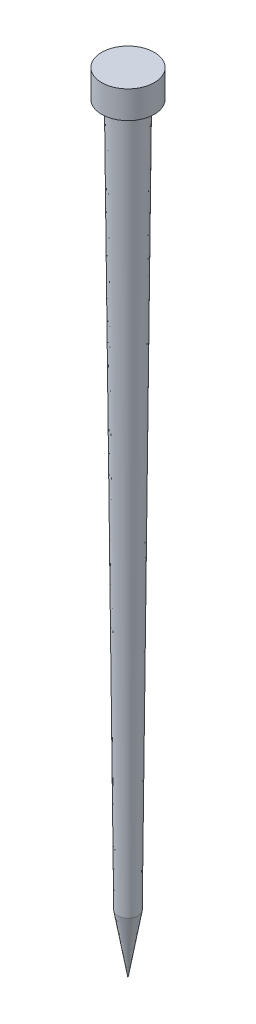
ISO-10303-21;
HEADER;
FILE_DESCRIPTION(('STEP AP214'),'2;1');
FILE_NAME('part.step','',(''),(''),'','','');
FILE_SCHEMA(('AUTOMOTIVE_DESIGN { 1 0 10303 214 1 1 1 1 }'));
ENDSEC;
DATA;
#1=APPLICATION_CONTEXT('core data for automotive mechanical design processes');
#2=APPLICATION_PROTOCOL_DEFINITION('international standard','automotive_design',2000,#1);
#3=PRODUCT_CONTEXT('',#1,'mechanical');
#4=PRODUCT('Part','Part','',(#3));
#5=PRODUCT_RELATED_PRODUCT_CATEGORY('part','',(#4));
#6=PRODUCT_DEFINITION_FORMATION('','',#4);
#7=PRODUCT_DEFINITION_CONTEXT('part definition',#1,'design');
#8=PRODUCT_DEFINITION('design','',#6,#7);
#9=PRODUCT_DEFINITION_SHAPE('','',#8);
#10=(LENGTH_UNIT() NAMED_UNIT(*) SI_UNIT(.MILLI.,.METRE.));
#11=(NAMED_UNIT(*) PLANE_ANGLE_UNIT() SI_UNIT($,.RADIAN.));
#12=(NAMED_UNIT(*) SI_UNIT($,.STERADIAN.) SOLID_ANGLE_UNIT());
#13=UNCERTAINTY_MEASURE_WITH_UNIT(LENGTH_MEASURE(1.E-05),#10,'distance_accuracy_value','');
#14=(GEOMETRIC_REPRESENTATION_CONTEXT(3) GLOBAL_UNCERTAINTY_ASSIGNED_CONTEXT((#13)) GLOBAL_UNIT_ASSIGNED_CONTEXT((#10,
#11,#12)) REPRESENTATION_CONTEXT('',''));
#15=CARTESIAN_POINT('',(0.,0.,0.));
#16=DIRECTION('',(0.,0.,1.));
#17=DIRECTION('',(1.,0.,0.));
#18=AXIS2_PLACEMENT_3D('',#15,#16,#17);
#19=CARTESIAN_POINT('',(0.,-21.4012791237792,0.));
#20=DIRECTION('',(0.,1.,0.));
#21=DIRECTION('',(0.,0.,1.));
#22=AXIS2_PLACEMENT_3D('',#19,#20,#21);
#23=CONICAL_SURFACE('',#22,0.328639164855815,0.1701475759757);
#24=CARTESIAN_POINT('',(0.,-20.4717320396996,0.));
#25=DIRECTION('',(0.,1.,0.));
#26=DIRECTION('',(0.,0.,1.));
#27=AXIS2_PLACEMENT_3D('',#24,#25,#26);
#28=CIRCLE('',#27,0.488343487882824);
#29=CARTESIAN_POINT('',(0.,-20.4717320396996,0.488343487882824));
#30=VERTEX_POINT('',#29);
#31=EDGE_CURVE('E11',#30,#30,#28,.T.);
#32=ORIENTED_EDGE('',*,*,#31,.F.);
#33=EDGE_LOOP('',(#32));
#34=FACE_BOUND('',#33,.T.);
#35=CARTESIAN_POINT('',(0.,-23.3140988372093,0.));
#36=VERTEX_POINT('',#35);
#37=VERTEX_LOOP('',#36);
#38=FACE_BOUND('',#37,.T.);
#39=ADVANCED_FACE('F41',(#34,#38),#23,.T.);
#40=CARTESIAN_POINT('',(0.,-20.4717320396996,0.));
#41=DIRECTION('',(0.,1.,0.));
#42=DIRECTION('',(0.,0.,1.));
#43=AXIS2_PLACEMENT_3D('',#40,#41,#42);
#44=CONICAL_SURFACE('',#43,0.488343487882824,0.00940924787477671);
#45=CARTESIAN_POINT('',(0.,13.4568313953488,0.));
#46=DIRECTION('',(0.,1.,0.));
#47=DIRECTION('',(0.,0.,1.));
#48=AXIS2_PLACEMENT_3D('',#45,#46,#47);
#49=CIRCLE('',#48,0.80759517287099);
#50=CARTESIAN_POINT('',(0.,13.4568313953488,0.80759517287099));
#51=VERTEX_POINT('',#50);
#52=EDGE_CURVE('E48',#51,#51,#49,.T.);
#53=ORIENTED_EDGE('',*,*,#52,.F.);
#54=EDGE_LOOP('',(#53));
#55=FACE_BOUND('',#54,.T.);
#56=ORIENTED_EDGE('',*,*,#31,.T.);
#57=EDGE_LOOP('',(#56));
#58=FACE_BOUND('',#57,.T.);
#59=ADVANCED_FACE('F52',(#55,#58),#44,.T.);
#60=CARTESIAN_POINT('',(0.80759517287099,13.4568313953488,0.));
#61=DIRECTION('',(0.,1.,0.));
#62=DIRECTION('',(0.,0.,1.));
#63=AXIS2_PLACEMENT_3D('',#60,#61,#62);
#64=PLANE('',#63);
#65=CARTESIAN_POINT('',(0.,13.4568313953488,0.));
#66=DIRECTION('',(0.,1.,0.));
#67=DIRECTION('',(0.,0.,1.));
#68=AXIS2_PLACEMENT_3D('',#65,#66,#67);
#69=CIRCLE('',#68,1.27);
#70=CARTESIAN_POINT('',(0.,13.4568313953488,1.27));
#71=VERTEX_POINT('',#70);
#72=EDGE_CURVE('E81',#71,#71,#69,.T.);
#73=ORIENTED_EDGE('',*,*,#72,.F.);
#74=EDGE_LOOP('',(#73));
#75=FACE_BOUND('',#74,.T.);
#76=ORIENTED_EDGE('',*,*,#52,.T.);
#77=EDGE_LOOP('',(#76));
#78=FACE_BOUND('',#77,.T.);
#79=ADVANCED_FACE('F57',(#75,#78),#64,.F.);
#80=CARTESIAN_POINT('',(0.,14.7859011627907,0.));
#81=DIRECTION('',(0.,1.,0.));
#82=DIRECTION('',(0.,0.,1.));
#83=AXIS2_PLACEMENT_3D('',#80,#81,#82);
#84=CYLINDRICAL_SURFACE('',#83,1.27);
#85=CARTESIAN_POINT('',(0.,14.7859011627907,0.));
#86=DIRECTION('',(0.,1.,0.));
#87=DIRECTION('',(0.,0.,1.));
#88=AXIS2_PLACEMENT_3D('',#85,#86,#87);
#89=CIRCLE('',#88,1.27);
#90=CARTESIAN_POINT('',(0.,14.7859011627907,1.27));
#91=VERTEX_POINT('',#90);
#92=EDGE_CURVE('E79',#91,#91,#89,.T.);
#93=ORIENTED_EDGE('',*,*,#92,.F.);
#94=EDGE_LOOP('',(#93));
#95=FACE_BOUND('',#94,.T.);
#96=ORIENTED_EDGE('',*,*,#72,.T.);
#97=EDGE_LOOP('',(#96));
#98=FACE_BOUND('',#97,.T.);
#99=ADVANCED_FACE('F64',(#95,#98),#84,.T.);
#100=CARTESIAN_POINT('',(1.27,14.7859011627907,0.));
#101=DIRECTION('',(0.,-1.,0.));
#102=DIRECTION('',(0.,0.,-1.));
#103=AXIS2_PLACEMENT_3D('',#100,#101,#102);
#104=PLANE('',#103);
#105=ORIENTED_EDGE('',*,*,#92,.T.);
#106=EDGE_LOOP('',(#105));
#107=FACE_BOUND('',#106,.T.);
#108=ADVANCED_FACE('F71',(#107),#104,.F.);
#109=CLOSED_SHELL('',(#39,#59,#79,#99,#108));
#110=MANIFOLD_SOLID_BREP('B2',#109);
#111=ADVANCED_BREP_SHAPE_REPRESENTATION('',(#18,#110),#14);
#112=SHAPE_DEFINITION_REPRESENTATION(#9,#111);
ENDSEC;
END-ISO-10303-21;
